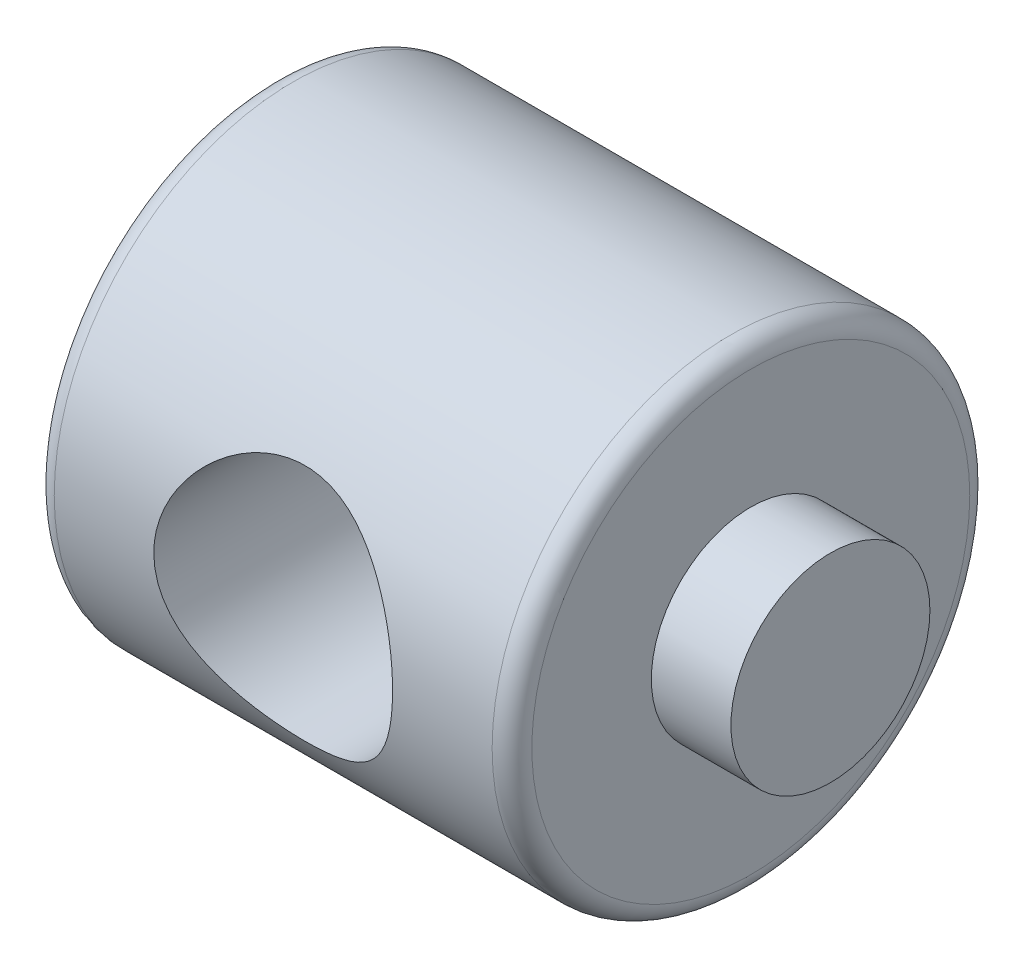
ISO-10303-21;
HEADER;
FILE_DESCRIPTION(('STEP AP214'),'2;1');
FILE_NAME('part.step','',(''),(''),'','','');
FILE_SCHEMA(('AUTOMOTIVE_DESIGN { 1 0 10303 214 1 1 1 1 }'));
ENDSEC;
DATA;
#1=APPLICATION_CONTEXT('core data for automotive mechanical design processes');
#2=APPLICATION_PROTOCOL_DEFINITION('international standard','automotive_design',2000,#1);
#3=PRODUCT_CONTEXT('',#1,'mechanical');
#4=PRODUCT('Part','Part','',(#3));
#5=PRODUCT_RELATED_PRODUCT_CATEGORY('part','',(#4));
#6=PRODUCT_DEFINITION_FORMATION('','',#4);
#7=PRODUCT_DEFINITION_CONTEXT('part definition',#1,'design');
#8=PRODUCT_DEFINITION('design','',#6,#7);
#9=PRODUCT_DEFINITION_SHAPE('','',#8);
#10=(LENGTH_UNIT() NAMED_UNIT(*) SI_UNIT(.MILLI.,.METRE.));
#11=(NAMED_UNIT(*) PLANE_ANGLE_UNIT() SI_UNIT($,.RADIAN.));
#12=(NAMED_UNIT(*) SI_UNIT($,.STERADIAN.) SOLID_ANGLE_UNIT());
#13=UNCERTAINTY_MEASURE_WITH_UNIT(LENGTH_MEASURE(1.E-05),#10,'distance_accuracy_value','');
#14=(GEOMETRIC_REPRESENTATION_CONTEXT(3) GLOBAL_UNCERTAINTY_ASSIGNED_CONTEXT((#13)) GLOBAL_UNIT_ASSIGNED_CONTEXT((#10,
#11,#12)) REPRESENTATION_CONTEXT('',''));
#15=CARTESIAN_POINT('',(0.,0.,0.));
#16=DIRECTION('',(0.,0.,1.));
#17=DIRECTION('',(1.,0.,0.));
#18=AXIS2_PLACEMENT_3D('',#15,#16,#17);
#19=CARTESIAN_POINT('',(9.525,0.,0.));
#20=DIRECTION('',(-1.,0.,0.));
#21=DIRECTION('',(0.,0.,1.));
#22=AXIS2_PLACEMENT_3D('',#19,#20,#21);
#23=CYLINDRICAL_SURFACE('',#22,9.525);
#24=CARTESIAN_POINT('',(-8.73252,0.,0.));
#25=DIRECTION('',(1.,0.,0.));
#26=DIRECTION('',(0.,0.,-1.));
#27=AXIS2_PLACEMENT_3D('',#24,#25,#26);
#28=CIRCLE('',#27,9.525);
#29=CARTESIAN_POINT('',(-8.73252,0.,-9.525));
#30=VERTEX_POINT('',#29);
#31=EDGE_CURVE('E101',#30,#30,#28,.T.);
#32=ORIENTED_EDGE('',*,*,#31,.T.);
#33=EDGE_LOOP('',(#32));
#34=FACE_BOUND('',#33,.T.);
#35=CARTESIAN_POINT('',(8.73252,0.,0.));
#36=DIRECTION('',(1.,0.,0.));
#37=DIRECTION('',(0.,0.,-1.));
#38=AXIS2_PLACEMENT_3D('',#35,#36,#37);
#39=CIRCLE('',#38,9.525);
#40=CARTESIAN_POINT('',(8.73252,0.,-9.525));
#41=VERTEX_POINT('',#40);
#42=EDGE_CURVE('E105',#41,#41,#39,.F.);
#43=ORIENTED_EDGE('',*,*,#42,.T.);
#44=EDGE_LOOP('',(#43));
#45=FACE_BOUND('',#44,.T.);
#46=CARTESIAN_POINT('',(-4.7625,0.,-9.52499999999999));
#47=CARTESIAN_POINT('',(-4.76249958831423,0.125243167799989,-9.5249996206372));
#48=CARTESIAN_POINT('',(-4.75755388154092,0.250495089131836,-9.52252400598023));
#49=CARTESIAN_POINT('',(-4.73782749335829,0.500076393496527,-9.51268396387997));
#50=CARTESIAN_POINT('',(-4.72304253341983,0.624405351393147,-9.50531740964972));
#51=CARTESIAN_POINT('',(-4.68378465754782,0.871331001268149,-9.48587193787975));
#52=CARTESIAN_POINT('',(-4.65929792572799,0.993924963523299,-9.47378630044847));
#53=CARTESIAN_POINT('',(-4.60090773438337,1.23637011508467,-9.44520637539277));
#54=CARTESIAN_POINT('',(-4.56700042522137,1.35622016139572,-9.42871028557932));
#55=CARTESIAN_POINT('',(-4.49029599546492,1.59183120722171,-9.39179697222459));
#56=CARTESIAN_POINT('',(-4.44753811225714,1.70760770137533,-9.37139708461428));
#57=CARTESIAN_POINT('',(-4.35345002008972,1.93495086483046,-9.3271126718355));
#58=CARTESIAN_POINT('',(-4.30211658479887,2.04651593025,-9.30322683559748));
#59=CARTESIAN_POINT('',(-4.13594585342936,2.37384489745524,-9.22716144615755));
#60=CARTESIAN_POINT('',(-4.00885268845467,2.58250225923314,-9.17053150857179));
#61=CARTESIAN_POINT('',(-3.7170309696508,2.98854538583361,-9.04666081910159));
#62=CARTESIAN_POINT('',(-3.55049071765087,3.18448556312959,-8.97898540114139));
#63=CARTESIAN_POINT('',(-3.18840889326789,3.5469969745544,-8.84205954293001));
#64=CARTESIAN_POINT('',(-2.99284542792683,3.71354582861884,-8.77280794740667));
#65=CARTESIAN_POINT('',(-2.5598674226152,4.02553537328567,-8.63435408613186));
#66=CARTESIAN_POINT('',(-2.32038345074362,4.16833749963762,-8.56557212539103));
#67=CARTESIAN_POINT('',(-1.94317806162735,4.35029005345508,-8.47379640254792));
#68=CARTESIAN_POINT('',(-1.81439982504697,4.40557901885787,-8.44509626519091));
#69=CARTESIAN_POINT('',(-1.55162131087767,4.50483773649694,-8.39256904955604));
#70=CARTESIAN_POINT('',(-1.41762417953859,4.54881419057647,-8.36873908777994));
#71=CARTESIAN_POINT('',(-1.15348439070287,4.62261399582858,-8.32818911059645));
#72=CARTESIAN_POINT('',(-1.0235845780924,4.65312214328153,-8.31113119648639));
#73=CARTESIAN_POINT('',(-0.761118312858166,4.70318378391281,-8.28290506375683));
#74=CARTESIAN_POINT('',(-0.628553313822606,4.72274308921002,-8.27173372047612));
#75=CARTESIAN_POINT('',(-0.361942745544747,4.75061653464239,-8.25575723957705));
#76=CARTESIAN_POINT('',(-0.227898117086414,4.75893744712047,-8.25094826797976));
#77=CARTESIAN_POINT('',(0.0404818193190395,4.76421854927812,-8.24790017307781));
#78=CARTESIAN_POINT('',(0.174817098310513,4.76117982286953,-8.24966042295241));
#79=CARTESIAN_POINT('',(0.4264394630534,4.74483797280581,-8.25906842780931));
#80=CARTESIAN_POINT('',(0.543838732731232,4.73280973448218,-8.26598467895691));
#81=CARTESIAN_POINT('',(0.77706332574491,4.7001560114978,-8.28459407928507));
#82=CARTESIAN_POINT('',(0.892888142929271,4.67952782662532,-8.29628872876443));
#83=CARTESIAN_POINT('',(1.23679640510272,4.60506661909892,-8.33800444414718));
#84=CARTESIAN_POINT('',(1.46148677858525,4.5386452957775,-8.374664603912));
#85=CARTESIAN_POINT('',(1.90136422745735,4.37297035741612,-8.46236620531704));
#86=CARTESIAN_POINT('',(2.11620803502557,4.27298801966147,-8.51372273880604));
#87=CARTESIAN_POINT('',(2.52713750391294,4.04355977442936,-8.62505005190895));
#88=CARTESIAN_POINT('',(2.72321468317278,3.91410063264098,-8.68502469635285));
#89=CARTESIAN_POINT('',(3.11715493103464,3.61029947812718,-8.8160120789406));
#90=CARTESIAN_POINT('',(3.31209202014425,3.43234782914613,-8.88746017331488));
#91=CARTESIAN_POINT('',(3.67064878147008,3.04584295330871,-9.02721381532401));
#92=CARTESIAN_POINT('',(3.83425348656057,2.83727518509305,-9.0955178493011));
#93=CARTESIAN_POINT('',(4.05616532663717,2.49965137796343,-9.19195370403877));
#94=CARTESIAN_POINT('',(4.12751797031745,2.38002127368373,-9.22372787983903));
#95=CARTESIAN_POINT('',(4.25977821368204,2.13427687141611,-9.28366556941997));
#96=CARTESIAN_POINT('',(4.32069021646027,2.00816533613017,-9.31183060399966));
#97=CARTESIAN_POINT('',(4.43140995548221,1.75034069526616,-9.36371844925579));
#98=CARTESIAN_POINT('',(4.48122216181515,1.61862987016266,-9.38744304755807));
#99=CARTESIAN_POINT('',(4.56916623782169,1.35056106639509,-9.42974072645533));
#100=CARTESIAN_POINT('',(4.60729945117316,1.21420362433566,-9.4483143996453));
#101=CARTESIAN_POINT('',(4.66871072091767,0.949450109300047,-9.47841891468132));
#102=CARTESIAN_POINT('',(4.69295751387122,0.821329961906901,-9.49040564136936));
#103=CARTESIAN_POINT('',(4.73088465881512,0.563164063018346,-9.50921741531494));
#104=CARTESIAN_POINT('',(4.74456594486943,0.433118482780758,-9.51604291885924));
#105=CARTESIAN_POINT('',(4.76117903695803,0.172222200636556,-9.52433687415141));
#106=CARTESIAN_POINT('',(4.76411495832146,0.0413718261918263,-9.52580737679104));
#107=CARTESIAN_POINT('',(4.75920856581017,-0.22007284716631,-9.52335444060485));
#108=CARTESIAN_POINT('',(4.75136672893597,-0.35066715715642,-9.51943124049279));
#109=CARTESIAN_POINT('',(4.72603956317407,-0.600383632816325,-9.50681651861088));
#110=CARTESIAN_POINT('',(4.70935204534436,-0.719607798059651,-9.49851975936574));
#111=CARTESIAN_POINT('',(4.66708381392194,-0.956123558476325,-9.47763434053446));
#112=CARTESIAN_POINT('',(4.64150028350313,-1.07341452918894,-9.46504432155854));
#113=CARTESIAN_POINT('',(4.58171294409776,-1.30523272581463,-9.43586934009923));
#114=CARTESIAN_POINT('',(4.54751177299423,-1.41976078572846,-9.41928560017321));
#115=CARTESIAN_POINT('',(4.47081767633952,-1.64542419391326,-9.382499981618));
#116=CARTESIAN_POINT('',(4.42832157448654,-1.75655822362735,-9.36229671724176));
#117=CARTESIAN_POINT('',(4.2862997139752,-2.09007412634845,-9.29566539786795));
#118=CARTESIAN_POINT('',(4.17391144344975,-2.3061103310862,-9.24405921515466));
#119=CARTESIAN_POINT('',(3.91901153595821,-2.71685918550571,-9.13180205397676));
#120=CARTESIAN_POINT('',(3.77648706665231,-2.91156269769227,-9.07114722574502));
#121=CARTESIAN_POINT('',(3.44920510528762,-3.29452731372962,-8.93960783885979));
#122=CARTESIAN_POINT('',(3.26167471385581,-3.48027815582499,-8.868303631423));
#123=CARTESIAN_POINT('',(2.8578138133799,-3.81886460963264,-8.72786114875584));
#124=CARTESIAN_POINT('',(2.64146354739159,-3.97167745144758,-8.65872439991558));
#125=CARTESIAN_POINT('',(2.29315273566663,-4.17638881115549,-8.56092960704944));
#126=CARTESIAN_POINT('',(2.16993704199734,-4.24173741059432,-8.52864647367417));
#127=CARTESIAN_POINT('',(1.91748336900803,-4.36167001930206,-8.46793790675362));
#128=CARTESIAN_POINT('',(1.78824815034193,-4.41625890421415,-8.43951072775552));
#129=CARTESIAN_POINT('',(1.52468862385271,-4.51403084118841,-8.3876228681576));
#130=CARTESIAN_POINT('',(1.39036857839808,-4.55722321448887,-8.36415813189979));
#131=CARTESIAN_POINT('',(1.11757678170936,-4.63167416627274,-8.32316235190995));
#132=CARTESIAN_POINT('',(0.979105676886764,-4.66293459251874,-8.30563038948562));
#133=CARTESIAN_POINT('',(0.712693855087645,-4.71062527640278,-8.27866590076996));
#134=CARTESIAN_POINT('',(0.585017991328243,-4.72819092555356,-8.26861751501085));
#135=CARTESIAN_POINT('',(0.328340803473241,-4.75291664228841,-8.25443000373948));
#136=CARTESIAN_POINT('',(0.199339619676057,-4.76007780009145,-8.25029025909993));
#137=CARTESIAN_POINT('',(-0.0588234710669094,-4.7638856717754,-8.24809207938036));
#138=CARTESIAN_POINT('',(-0.187985305559263,-4.76053608147038,-8.25003150672727));
#139=CARTESIAN_POINT('',(-0.445375243945349,-4.74338307929259,-8.2599055190099));
#140=CARTESIAN_POINT('',(-0.573603385847069,-4.72958009537705,-8.26783985851659));
#141=CARTESIAN_POINT('',(-0.815873592556459,-4.69353669139923,-8.28834856879423));
#142=CARTESIAN_POINT('',(-0.93009963804179,-4.67222934629288,-8.30040666790683));
#143=CARTESIAN_POINT('',(-1.15620278401552,-4.62147643847892,-8.32877048505192));
#144=CARTESIAN_POINT('',(-1.26807914659067,-4.59202835912458,-8.34507751652014));
#145=CARTESIAN_POINT('',(-1.59916855214504,-4.49189766535446,-8.3996615585496));
#146=CARTESIAN_POINT('',(-1.81399443047417,-4.40940547807408,-8.44361545117001));
#147=CARTESIAN_POINT('',(-2.24138522605267,-4.20916574352957,-8.54528603634261));
#148=CARTESIAN_POINT('',(-2.45282854237986,-4.08942191082135,-8.60372898549138));
#149=CARTESIAN_POINT('',(-2.85403681438992,-3.82024338512734,-8.72658246261697));
#150=CARTESIAN_POINT('',(-3.04379041048057,-3.67079324521365,-8.79099608593484));
#151=CARTESIAN_POINT('',(-3.42014923519336,-3.32520368388597,-8.92789150982252));
#152=CARTESIAN_POINT('',(-3.60357040787616,-3.12559766366325,-9.00040265167881));
#153=CARTESIAN_POINT('',(-3.93509603617707,-2.69626914168462,-9.13818513010387));
#154=CARTESIAN_POINT('',(-4.08318145555075,-2.4665305095516,-9.20345255422175));
#155=CARTESIAN_POINT('',(-4.2754204698368,-2.10268072495818,-9.29086610240478));
#156=CARTESIAN_POINT('',(-4.33470089313457,-1.97763300723182,-9.31834760006229));
#157=CARTESIAN_POINT('',(-4.44239918870466,-1.72211552262134,-9.36893044835914));
#158=CARTESIAN_POINT('',(-4.49082239743041,-1.59164845695407,-9.39203394996841));
#159=CARTESIAN_POINT('',(-4.57613903004475,-1.32654199767925,-9.43312646132604));
#160=CARTESIAN_POINT('',(-4.6130576010708,-1.19191242135595,-9.45112661821364));
#161=CARTESIAN_POINT('',(-4.67500106044581,-0.919388438520269,-9.48151473751691));
#162=CARTESIAN_POINT('',(-4.700033214082,-0.781496080561075,-9.49390612793915));
#163=CARTESIAN_POINT('',(-4.73342449172891,-0.536297175823772,-9.51048759454479));
#164=CARTESIAN_POINT('',(-4.74431844539165,-0.42941158376785,-9.51592021375587));
#165=CARTESIAN_POINT('',(-4.75885647628327,-0.215019489362879,-9.52317662911679));
#166=CARTESIAN_POINT('',(-4.76250035340498,-0.107512969957934,-9.52500032565784));
#167=CARTESIAN_POINT('',(-4.7625,0.,-9.52499999999999));
#168=B_SPLINE_CURVE_WITH_KNOTS('',3,(#46,#47,#48,#49,#50,#51,#52,#53,#54,#55,#56,#57,#58,#59,
#60,#61,#62,#63,#64,#65,#66,#67,#68,#69,#70,#71,#72,#73,#74,#75,#76,#77,#78,#79,#80,#81,#82,#83,
#84,#85,#86,#87,#88,#89,#90,#91,#92,#93,#94,#95,#96,#97,#98,#99,#100,#101,#102,#103,#104,#105,
#106,#107,#108,#109,#110,#111,#112,#113,#114,#115,#116,#117,#118,#119,#120,#121,#122,#123,#124,
#125,#126,#127,#128,#129,#130,#131,#132,#133,#134,#135,#136,#137,#138,#139,#140,#141,#142,#143,
#144,#145,#146,#147,#148,#149,#150,#151,#152,#153,#154,#155,#156,#157,#158,#159,#160,#161,#162,
#163,#164,#165,#166,#167),.UNSPECIFIED.,.T.,.F.,(4,2,2,2,2,2,2,2,2,2,2,2,2,2,2,2,2,2,2,2,2,2,2,
2,2,2,2,2,2,2,2,2,2,2,2,2,2,2,2,2,2,2,2,2,2,2,2,2,2,2,2,2,2,2,2,2,2,2,2,2,4),(0.,
0.375623418154021,0.751410280296022,1.12773421934006,1.50421216665563,1.87905550525341,
2.25404018794787,3.00318908218551,3.7976597983107,4.59273287924314,5.4494638936804,
5.8781190538996,6.30651967909289,6.70950847539315,7.11228314445237,7.51481498990845,
7.91730842763879,8.27152461989833,8.62585211283934,9.33399259637595,10.0586277474397,
10.7835888844336,11.6004728904415,12.4177461446779,12.8458801890468,13.2738332313566,
13.701613616489,14.1293447666274,14.521651524315,14.913923595397,15.3060454158579,
15.698149882404,16.0597456619957,16.4214560413944,16.7830558344936,17.144794364286,
17.8882174899416,18.6319578135026,19.4487341785404,20.2660733794108,20.6950689367829,
21.1238696504806,21.5523185520335,21.9807010777177,22.3679690015927,22.7551963432537,
23.1422875423821,23.5293628950278,23.8794231642634,24.2295917732494,24.9294696536928,
25.6763690993088,26.423657944613,27.2617475314397,28.1002876036314,28.5230685284024,
28.9456411934233,29.3672836019069,29.7886679587935,30.1111069020891,30.4335547448008),.UNSPECIFIED.);
#169=CARTESIAN_POINT('',(-4.7625,0.,-9.52499999999999));
#170=VERTEX_POINT('',#169);
#171=EDGE_CURVE('E46',#170,#170,#168,.T.);
#172=ORIENTED_EDGE('',*,*,#171,.F.);
#173=EDGE_LOOP('',(#172));
#174=FACE_BOUND('',#173,.T.);
#175=CARTESIAN_POINT('',(-4.7625,0.,9.525));
#176=CARTESIAN_POINT('',(-4.76249958831423,-0.125243167799989,9.5249996206372));
#177=CARTESIAN_POINT('',(-4.75755388154092,-0.250495089131835,9.52252400598023));
#178=CARTESIAN_POINT('',(-4.73782749335829,-0.500076393496525,9.51268396387997));
#179=CARTESIAN_POINT('',(-4.72304253341983,-0.624405351393145,9.50531740964971));
#180=CARTESIAN_POINT('',(-4.68378465754782,-0.871331001268147,9.48587193787975));
#181=CARTESIAN_POINT('',(-4.65929792572799,-0.993924963523297,9.47378630044847));
#182=CARTESIAN_POINT('',(-4.60090773438337,-1.23637011508467,9.44520637539277));
#183=CARTESIAN_POINT('',(-4.56700042522137,-1.35622016139572,9.42871028557932));
#184=CARTESIAN_POINT('',(-4.49029599546492,-1.59183120722171,9.39179697222459));
#185=CARTESIAN_POINT('',(-4.44753811225714,-1.70760770137533,9.37139708461428));
#186=CARTESIAN_POINT('',(-4.35345002008972,-1.93495086483045,9.3271126718355));
#187=CARTESIAN_POINT('',(-4.30211658479887,-2.04651593025,9.30322683559748));
#188=CARTESIAN_POINT('',(-4.13594585342937,-2.37384489745524,9.22716144615755));
#189=CARTESIAN_POINT('',(-4.00885268845467,-2.58250225923313,9.17053150857179));
#190=CARTESIAN_POINT('',(-3.7170309696508,-2.9885453858336,9.04666081910159));
#191=CARTESIAN_POINT('',(-3.55049071765087,-3.18448556312959,8.97898540114139));
#192=CARTESIAN_POINT('',(-3.18840889326789,-3.5469969745544,8.84205954293001));
#193=CARTESIAN_POINT('',(-2.99284542792684,-3.71354582861883,8.77280794740667));
#194=CARTESIAN_POINT('',(-2.5598674226152,-4.02553537328567,8.63435408613187));
#195=CARTESIAN_POINT('',(-2.32038345074362,-4.16833749963762,8.56557212539103));
#196=CARTESIAN_POINT('',(-1.94317806162735,-4.35029005345507,8.47379640254792));
#197=CARTESIAN_POINT('',(-1.81439982504698,-4.40557901885787,8.44509626519091));
#198=CARTESIAN_POINT('',(-1.55162131087768,-4.50483773649694,8.39256904955604));
#199=CARTESIAN_POINT('',(-1.4176241795386,-4.54881419057647,8.36873908777994));
#200=CARTESIAN_POINT('',(-1.15348439070288,-4.62261399582858,8.32818911059645));
#201=CARTESIAN_POINT('',(-1.0235845780924,-4.65312214328153,8.31113119648639));
#202=CARTESIAN_POINT('',(-0.761118312858172,-4.7031837839128,8.28290506375683));
#203=CARTESIAN_POINT('',(-0.628553313822611,-4.72274308921002,8.27173372047612));
#204=CARTESIAN_POINT('',(-0.361942745544751,-4.75061653464239,8.25575723957705));
#205=CARTESIAN_POINT('',(-0.227898117086418,-4.75893744712047,8.25094826797976));
#206=CARTESIAN_POINT('',(0.0404818193190357,-4.76421854927812,8.24790017307781));
#207=CARTESIAN_POINT('',(0.17481709831051,-4.76117982286953,8.24966042295241));
#208=CARTESIAN_POINT('',(0.426439463053397,-4.74483797280581,8.25906842780931));
#209=CARTESIAN_POINT('',(0.543838732731229,-4.73280973448218,8.26598467895691));
#210=CARTESIAN_POINT('',(0.777063325744908,-4.7001560114978,8.28459407928507));
#211=CARTESIAN_POINT('',(0.892888142929269,-4.67952782662532,8.29628872876442));
#212=CARTESIAN_POINT('',(1.23679640510272,-4.60506661909892,8.33800444414718));
#213=CARTESIAN_POINT('',(1.46148677858524,-4.5386452957775,8.37466460391199));
#214=CARTESIAN_POINT('',(1.90136422745735,-4.37297035741612,8.46236620531704));
#215=CARTESIAN_POINT('',(2.11620803502557,-4.27298801966147,8.51372273880604));
#216=CARTESIAN_POINT('',(2.52713750391294,-4.04355977442936,8.62505005190895));
#217=CARTESIAN_POINT('',(2.72321468317278,-3.91410063264099,8.68502469635285));
#218=CARTESIAN_POINT('',(3.11715493103464,-3.61029947812719,8.8160120789406));
#219=CARTESIAN_POINT('',(3.31209202014425,-3.43234782914613,8.88746017331488));
#220=CARTESIAN_POINT('',(3.67064878147008,-3.04584295330871,9.02721381532401));
#221=CARTESIAN_POINT('',(3.83425348656056,-2.83727518509305,9.0955178493011));
#222=CARTESIAN_POINT('',(4.05616532663717,-2.49965137796343,9.19195370403877));
#223=CARTESIAN_POINT('',(4.12751797031745,-2.38002127368373,9.22372787983903));
#224=CARTESIAN_POINT('',(4.25977821368204,-2.13427687141612,9.28366556941997));
#225=CARTESIAN_POINT('',(4.32069021646027,-2.00816533613018,9.31183060399966));
#226=CARTESIAN_POINT('',(4.43140995548221,-1.75034069526616,9.36371844925579));
#227=CARTESIAN_POINT('',(4.48122216181515,-1.61862987016266,9.38744304755806));
#228=CARTESIAN_POINT('',(4.56916623782169,-1.3505610663951,9.42974072645533));
#229=CARTESIAN_POINT('',(4.60729945117316,-1.21420362433566,9.4483143996453));
#230=CARTESIAN_POINT('',(4.66871072091767,-0.949450109300049,9.47841891468132));
#231=CARTESIAN_POINT('',(4.69295751387122,-0.821329961906902,9.49040564136936));
#232=CARTESIAN_POINT('',(4.73088465881512,-0.563164063018348,9.50921741531494));
#233=CARTESIAN_POINT('',(4.74456594486943,-0.43311848278076,9.51604291885924));
#234=CARTESIAN_POINT('',(4.76117903695802,-0.172222200636559,9.52433687415141));
#235=CARTESIAN_POINT('',(4.76411495832146,-0.0413718261918291,9.52580737679104));
#236=CARTESIAN_POINT('',(4.75920856581017,0.220072847166308,9.52335444060485));
#237=CARTESIAN_POINT('',(4.75136672893597,0.350667157156417,9.51943124049279));
#238=CARTESIAN_POINT('',(4.72603956317407,0.600383632816323,9.50681651861088));
#239=CARTESIAN_POINT('',(4.70935204534436,0.71960779805965,9.49851975936574));
#240=CARTESIAN_POINT('',(4.66708381392194,0.956123558476324,9.47763434053446));
#241=CARTESIAN_POINT('',(4.64150028350313,1.07341452918894,9.46504432155854));
#242=CARTESIAN_POINT('',(4.58171294409776,1.30523272581462,9.43586934009923));
#243=CARTESIAN_POINT('',(4.54751177299423,1.41976078572846,9.41928560017321));
#244=CARTESIAN_POINT('',(4.47081767633952,1.64542419391326,9.382499981618));
#245=CARTESIAN_POINT('',(4.42832157448654,1.75655822362735,9.36229671724176));
#246=CARTESIAN_POINT('',(4.2862997139752,2.09007412634844,9.29566539786795));
#247=CARTESIAN_POINT('',(4.17391144344975,2.3061103310862,9.24405921515466));
#248=CARTESIAN_POINT('',(3.91901153595821,2.7168591855057,9.13180205397676));
#249=CARTESIAN_POINT('',(3.77648706665232,2.91156269769227,9.07114722574502));
#250=CARTESIAN_POINT('',(3.44920510528762,3.29452731372962,8.93960783885979));
#251=CARTESIAN_POINT('',(3.26167471385581,3.48027815582499,8.868303631423));
#252=CARTESIAN_POINT('',(2.85781381337991,3.81886460963264,8.72786114875584));
#253=CARTESIAN_POINT('',(2.64146354739159,3.97167745144758,8.65872439991558));
#254=CARTESIAN_POINT('',(2.29315273566664,4.17638881115548,8.56092960704944));
#255=CARTESIAN_POINT('',(2.16993704199735,4.24173741059432,8.52864647367417));
#256=CARTESIAN_POINT('',(1.91748336900804,4.36167001930206,8.46793790675362));
#257=CARTESIAN_POINT('',(1.78824815034194,4.41625890421415,8.43951072775552));
#258=CARTESIAN_POINT('',(1.52468862385272,4.51403084118841,8.3876228681576));
#259=CARTESIAN_POINT('',(1.39036857839809,4.55722321448887,8.36415813189979));
#260=CARTESIAN_POINT('',(1.11757678170937,4.63167416627274,8.32316235190995));
#261=CARTESIAN_POINT('',(0.97910567688677,4.66293459251873,8.30563038948562));
#262=CARTESIAN_POINT('',(0.712693855087652,4.71062527640278,8.27866590076996));
#263=CARTESIAN_POINT('',(0.58501799132825,4.72819092555356,8.26861751501085));
#264=CARTESIAN_POINT('',(0.328340803473249,4.75291664228841,8.25443000373948));
#265=CARTESIAN_POINT('',(0.199339619676065,4.76007780009145,8.25029025909993));
#266=CARTESIAN_POINT('',(-0.0588234710669033,4.7638856717754,8.24809207938036));
#267=CARTESIAN_POINT('',(-0.187985305559258,4.76053608147038,8.25003150672727));
#268=CARTESIAN_POINT('',(-0.445375243945346,4.74338307929259,8.2599055190099));
#269=CARTESIAN_POINT('',(-0.573603385847065,4.72958009537705,8.26783985851659));
#270=CARTESIAN_POINT('',(-0.815873592556455,4.69353669139923,8.28834856879423));
#271=CARTESIAN_POINT('',(-0.930099638041786,4.67222934629288,8.30040666790683));
#272=CARTESIAN_POINT('',(-1.15620278401551,4.62147643847892,8.32877048505192));
#273=CARTESIAN_POINT('',(-1.26807914659067,4.59202835912458,8.34507751652014));
#274=CARTESIAN_POINT('',(-1.59916855214504,4.49189766535446,8.3996615585496));
#275=CARTESIAN_POINT('',(-1.81399443047416,4.40940547807408,8.44361545117001));
#276=CARTESIAN_POINT('',(-2.24138522605267,4.20916574352957,8.54528603634261));
#277=CARTESIAN_POINT('',(-2.45282854237986,4.08942191082135,8.60372898549138));
#278=CARTESIAN_POINT('',(-2.85403681438992,3.82024338512734,8.72658246261697));
#279=CARTESIAN_POINT('',(-3.04379041048057,3.67079324521365,8.79099608593484));
#280=CARTESIAN_POINT('',(-3.42014923519336,3.32520368388597,8.92789150982252));
#281=CARTESIAN_POINT('',(-3.60357040787616,3.12559766366325,9.00040265167881));
#282=CARTESIAN_POINT('',(-3.93509603617707,2.69626914168462,9.13818513010387));
#283=CARTESIAN_POINT('',(-4.08318145555075,2.4665305095516,9.20345255422175));
#284=CARTESIAN_POINT('',(-4.2754204698368,2.10268072495819,9.29086610240478));
#285=CARTESIAN_POINT('',(-4.33470089313457,1.97763300723183,9.31834760006229));
#286=CARTESIAN_POINT('',(-4.44239918870466,1.72211552262134,9.36893044835914));
#287=CARTESIAN_POINT('',(-4.49082239743041,1.59164845695407,9.39203394996841));
#288=CARTESIAN_POINT('',(-4.57613903004474,1.32654199767926,9.43312646132604));
#289=CARTESIAN_POINT('',(-4.6130576010708,1.19191242135595,9.45112661821364));
#290=CARTESIAN_POINT('',(-4.67500106044581,0.919388438520272,9.48151473751691));
#291=CARTESIAN_POINT('',(-4.700033214082,0.781496080561078,9.49390612793916));
#292=CARTESIAN_POINT('',(-4.73342449172891,0.536297175823774,9.51048759454479));
#293=CARTESIAN_POINT('',(-4.74431844539165,0.429411583767851,9.51592021375587));
#294=CARTESIAN_POINT('',(-4.75885647628327,0.215019489362879,9.52317662911679));
#295=CARTESIAN_POINT('',(-4.76250035340499,0.107512969957934,9.52500032565785));
#296=CARTESIAN_POINT('',(-4.7625,0.,9.525));
#297=B_SPLINE_CURVE_WITH_KNOTS('',3,(#175,#176,#177,#178,#179,#180,#181,#182,#183,#184,#185,
#186,#187,#188,#189,#190,#191,#192,#193,#194,#195,#196,#197,#198,#199,#200,#201,#202,#203,#204,
#205,#206,#207,#208,#209,#210,#211,#212,#213,#214,#215,#216,#217,#218,#219,#220,#221,#222,#223,
#224,#225,#226,#227,#228,#229,#230,#231,#232,#233,#234,#235,#236,#237,#238,#239,#240,#241,#242,
#243,#244,#245,#246,#247,#248,#249,#250,#251,#252,#253,#254,#255,#256,#257,#258,#259,#260,#261,
#262,#263,#264,#265,#266,#267,#268,#269,#270,#271,#272,#273,#274,#275,#276,#277,#278,#279,#280,
#281,#282,#283,#284,#285,#286,#287,#288,#289,#290,#291,#292,#293,#294,#295,#296),.UNSPECIFIED.,
.T.,.F.,(4,2,2,2,2,2,2,2,2,2,2,2,2,2,2,2,2,2,2,2,2,2,2,2,2,2,2,2,2,2,2,2,2,2,2,2,2,2,2,2,2,2,2,
2,2,2,2,2,2,2,2,2,2,2,2,2,2,2,2,2,4),(0.,0.37562341815402,0.751410280296021,1.12773421934005,
1.50421216665562,1.87905550525341,2.25404018794787,3.00318908218551,3.79765979831069,
4.59273287924314,5.44946389368039,5.8781190538996,6.30651967909288,6.70950847539314,
7.11228314445236,7.51481498990845,7.91730842763879,8.27152461989833,8.62585211283934,
9.33399259637595,10.0586277474397,10.7835888844336,11.6004728904415,12.4177461446779,
12.8458801890468,13.2738332313566,13.701613616489,14.1293447666274,14.521651524315,
14.913923595397,15.3060454158579,15.698149882404,16.0597456619957,16.4214560413944,
16.7830558344937,17.144794364286,17.8882174899416,18.6319578135026,19.4487341785404,
20.2660733794108,20.6950689367829,21.1238696504806,21.5523185520335,21.9807010777177,
22.3679690015927,22.7551963432537,23.1422875423821,23.5293628950278,23.8794231642634,
24.2295917732494,24.9294696536929,25.6763690993088,26.4236579446131,27.2617475314397,
28.1002876036314,28.5230685284024,28.9456411934233,29.3672836019069,29.7886679587935,
30.1111069020891,30.4335547448008),.UNSPECIFIED.);
#298=CARTESIAN_POINT('',(-4.7625,0.,9.525));
#299=VERTEX_POINT('',#298);
#300=EDGE_CURVE('E10',#299,#299,#297,.T.);
#301=ORIENTED_EDGE('',*,*,#300,.F.);
#302=EDGE_LOOP('',(#301));
#303=FACE_BOUND('',#302,.T.);
#304=ADVANCED_FACE('F34',(#34,#45,#174,#303),#23,.T.);
#305=CARTESIAN_POINT('',(9.525,0.,0.));
#306=DIRECTION('',(1.,0.,0.));
#307=DIRECTION('',(0.,0.,-1.));
#308=AXIS2_PLACEMENT_3D('',#305,#306,#307);
#309=PLANE('',#308);
#310=CARTESIAN_POINT('',(9.525,0.,0.));
#311=DIRECTION('',(1.,0.,0.));
#312=DIRECTION('',(0.,0.,-1.));
#313=AXIS2_PLACEMENT_3D('',#310,#311,#312);
#314=CIRCLE('',#313,8.73252);
#315=CARTESIAN_POINT('',(9.525,0.,-8.73252));
#316=VERTEX_POINT('',#315);
#317=EDGE_CURVE('E54',#316,#316,#314,.T.);
#318=ORIENTED_EDGE('',*,*,#317,.T.);
#319=EDGE_LOOP('',(#318));
#320=FACE_BOUND('',#319,.T.);
#321=CARTESIAN_POINT('',(9.525,0.,0.));
#322=DIRECTION('',(1.,0.,0.));
#323=DIRECTION('',(0.,0.,-1.));
#324=AXIS2_PLACEMENT_3D('',#321,#322,#323);
#325=CIRCLE('',#324,3.96875);
#326=CARTESIAN_POINT('',(9.525,0.,-3.96875));
#327=VERTEX_POINT('',#326);
#328=EDGE_CURVE('E108',#327,#327,#325,.T.);
#329=ORIENTED_EDGE('',*,*,#328,.F.);
#330=EDGE_LOOP('',(#329));
#331=FACE_BOUND('',#330,.T.);
#332=ADVANCED_FACE('F85',(#320,#331),#309,.T.);
#333=CARTESIAN_POINT('',(-9.525,0.,0.));
#334=DIRECTION('',(1.,0.,0.));
#335=DIRECTION('',(0.,0.,-1.));
#336=AXIS2_PLACEMENT_3D('',#333,#334,#335);
#337=PLANE('',#336);
#338=CARTESIAN_POINT('',(-9.525,0.,0.));
#339=DIRECTION('',(1.,0.,0.));
#340=DIRECTION('',(0.,0.,-1.));
#341=AXIS2_PLACEMENT_3D('',#338,#339,#340);
#342=CIRCLE('',#341,3.96875);
#343=CARTESIAN_POINT('',(-9.525,0.,-3.96875));
#344=VERTEX_POINT('',#343);
#345=EDGE_CURVE('E50',#344,#344,#342,.F.);
#346=ORIENTED_EDGE('',*,*,#345,.F.);
#347=EDGE_LOOP('',(#346));
#348=FACE_BOUND('',#347,.T.);
#349=CARTESIAN_POINT('',(-9.525,0.,0.));
#350=DIRECTION('',(1.,0.,0.));
#351=DIRECTION('',(0.,0.,-1.));
#352=AXIS2_PLACEMENT_3D('',#349,#350,#351);
#353=CIRCLE('',#352,8.73252);
#354=CARTESIAN_POINT('',(-9.525,0.,-8.73252));
#355=VERTEX_POINT('',#354);
#356=EDGE_CURVE('E110',#355,#355,#353,.F.);
#357=ORIENTED_EDGE('',*,*,#356,.T.);
#358=EDGE_LOOP('',(#357));
#359=FACE_BOUND('',#358,.T.);
#360=ADVANCED_FACE('F83',(#348,#359),#337,.F.);
#361=CARTESIAN_POINT('',(12.7,0.,0.));
#362=DIRECTION('',(-1.,0.,0.));
#363=DIRECTION('',(0.,0.,1.));
#364=AXIS2_PLACEMENT_3D('',#361,#362,#363);
#365=CYLINDRICAL_SURFACE('',#364,3.96875);
#366=CARTESIAN_POINT('',(12.7,0.,0.));
#367=DIRECTION('',(1.,0.,0.));
#368=DIRECTION('',(0.,0.,-1.));
#369=AXIS2_PLACEMENT_3D('',#366,#367,#368);
#370=CIRCLE('',#369,3.96875);
#371=CARTESIAN_POINT('',(12.7,0.,-3.96875));
#372=VERTEX_POINT('',#371);
#373=EDGE_CURVE('E113',#372,#372,#370,.T.);
#374=ORIENTED_EDGE('',*,*,#373,.F.);
#375=EDGE_LOOP('',(#374));
#376=FACE_BOUND('',#375,.T.);
#377=ORIENTED_EDGE('',*,*,#328,.T.);
#378=EDGE_LOOP('',(#377));
#379=FACE_BOUND('',#378,.T.);
#380=ADVANCED_FACE('F79',(#376,#379),#365,.T.);
#381=CARTESIAN_POINT('',(12.7,0.,0.));
#382=DIRECTION('',(1.,0.,0.));
#383=DIRECTION('',(0.,0.,-1.));
#384=AXIS2_PLACEMENT_3D('',#381,#382,#383);
#385=PLANE('',#384);
#386=ORIENTED_EDGE('',*,*,#373,.T.);
#387=EDGE_LOOP('',(#386));
#388=FACE_BOUND('',#387,.T.);
#389=ADVANCED_FACE('F75',(#388),#385,.T.);
#390=CARTESIAN_POINT('',(-8.73252,0.,0.));
#391=DIRECTION('',(1.,0.,0.));
#392=DIRECTION('',(0.,0.,-1.));
#393=AXIS2_PLACEMENT_3D('',#390,#391,#392);
#394=TOROIDAL_SURFACE('',#393,8.73252,0.79248);
#395=ORIENTED_EDGE('',*,*,#356,.F.);
#396=EDGE_LOOP('',(#395));
#397=FACE_BOUND('',#396,.T.);
#398=ORIENTED_EDGE('',*,*,#31,.F.);
#399=EDGE_LOOP('',(#398));
#400=FACE_BOUND('',#399,.T.);
#401=ADVANCED_FACE('F78',(#397,#400),#394,.T.);
#402=CARTESIAN_POINT('',(8.73252,0.,0.));
#403=DIRECTION('',(1.,0.,0.));
#404=DIRECTION('',(0.,0.,-1.));
#405=AXIS2_PLACEMENT_3D('',#402,#403,#404);
#406=TOROIDAL_SURFACE('',#405,8.73252,0.79248);
#407=ORIENTED_EDGE('',*,*,#42,.F.);
#408=EDGE_LOOP('',(#407));
#409=FACE_BOUND('',#408,.T.);
#410=ORIENTED_EDGE('',*,*,#317,.F.);
#411=EDGE_LOOP('',(#410));
#412=FACE_BOUND('',#411,.T.);
#413=ADVANCED_FACE('F36',(#409,#412),#406,.T.);
#414=CARTESIAN_POINT('',(-12.7,0.,0.));
#415=DIRECTION('',(1.,0.,0.));
#416=DIRECTION('',(0.,0.,-1.));
#417=AXIS2_PLACEMENT_3D('',#414,#415,#416);
#418=CYLINDRICAL_SURFACE('',#417,3.96875);
#419=CARTESIAN_POINT('',(-12.7,0.,0.));
#420=DIRECTION('',(-1.,0.,0.));
#421=DIRECTION('',(0.,0.,1.));
#422=AXIS2_PLACEMENT_3D('',#419,#420,#421);
#423=CIRCLE('',#422,3.96875);
#424=CARTESIAN_POINT('',(-12.7,0.,3.96875));
#425=VERTEX_POINT('',#424);
#426=EDGE_CURVE('E187',#425,#425,#423,.T.);
#427=ORIENTED_EDGE('',*,*,#426,.F.);
#428=EDGE_LOOP('',(#427));
#429=FACE_BOUND('',#428,.T.);
#430=ORIENTED_EDGE('',*,*,#345,.T.);
#431=EDGE_LOOP('',(#430));
#432=FACE_BOUND('',#431,.T.);
#433=ADVANCED_FACE('F70',(#429,#432),#418,.T.);
#434=CARTESIAN_POINT('',(-12.7,0.,0.));
#435=DIRECTION('',(-1.,0.,0.));
#436=DIRECTION('',(0.,0.,1.));
#437=AXIS2_PLACEMENT_3D('',#434,#435,#436);
#438=PLANE('',#437);
#439=ORIENTED_EDGE('',*,*,#426,.T.);
#440=EDGE_LOOP('',(#439));
#441=FACE_BOUND('',#440,.T.);
#442=ADVANCED_FACE('F66',(#441),#438,.T.);
#443=CARTESIAN_POINT('',(0.,0.,9.525));
#444=DIRECTION('',(0.,0.,-1.));
#445=DIRECTION('',(-1.,0.,0.));
#446=AXIS2_PLACEMENT_3D('',#443,#444,#445);
#447=CYLINDRICAL_SURFACE('',#446,4.7625);
#448=ORIENTED_EDGE('',*,*,#171,.T.);
#449=EDGE_LOOP('',(#448));
#450=FACE_BOUND('',#449,.T.);
#451=ORIENTED_EDGE('',*,*,#300,.T.);
#452=EDGE_LOOP('',(#451));
#453=FACE_BOUND('',#452,.T.);
#454=ADVANCED_FACE('F62',(#450,#453),#447,.F.);
#455=CLOSED_SHELL('',(#304,#332,#360,#380,#389,#401,#413,#433,#442,#454));
#456=MANIFOLD_SOLID_BREP('B2',#455);
#457=ADVANCED_BREP_SHAPE_REPRESENTATION('',(#18,#456),#14);
#458=SHAPE_DEFINITION_REPRESENTATION(#9,#457);
ENDSEC;
END-ISO-10303-21;
